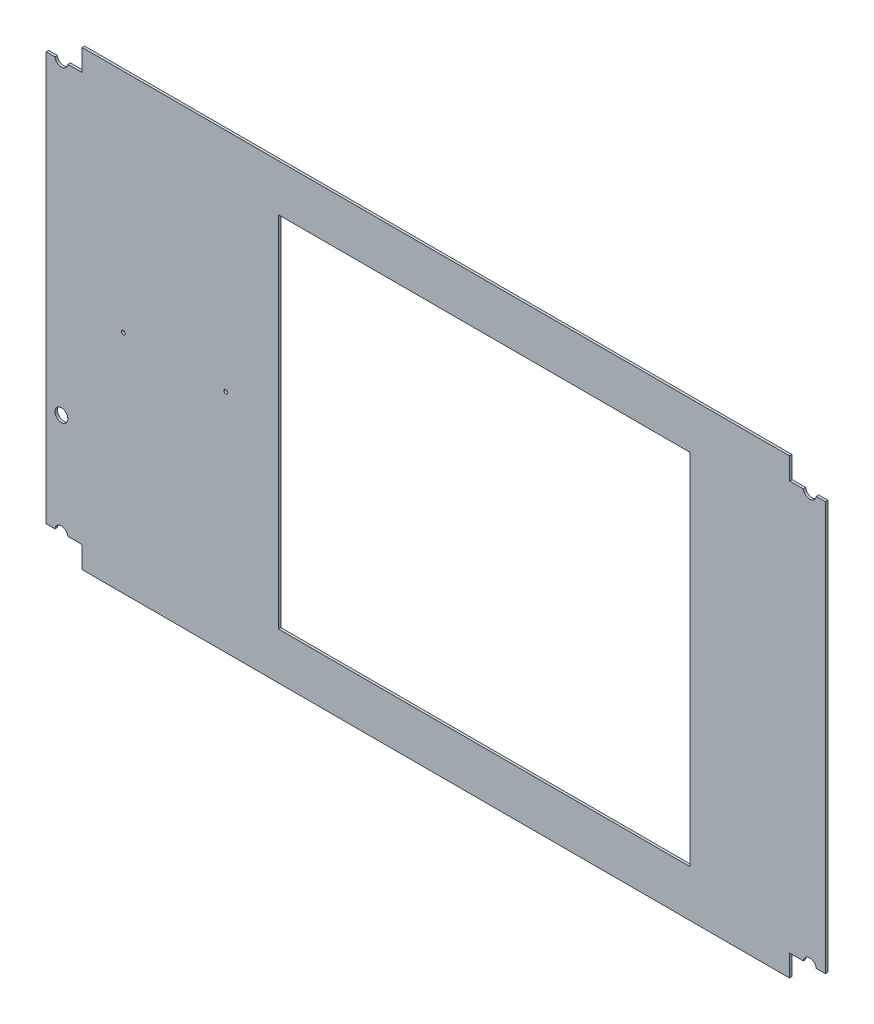
ISO-10303-21;
HEADER;
FILE_DESCRIPTION(('STEP AP214'),'2;1');
FILE_NAME('part.step','',(''),(''),'','','');
FILE_SCHEMA(('AUTOMOTIVE_DESIGN { 1 0 10303 214 1 1 1 1 }'));
ENDSEC;
DATA;
#1=APPLICATION_CONTEXT('core data for automotive mechanical design processes');
#2=APPLICATION_PROTOCOL_DEFINITION('international standard','automotive_design',2000,#1);
#3=PRODUCT_CONTEXT('',#1,'mechanical');
#4=PRODUCT('Part','Part','',(#3));
#5=PRODUCT_RELATED_PRODUCT_CATEGORY('part','',(#4));
#6=PRODUCT_DEFINITION_FORMATION('','',#4);
#7=PRODUCT_DEFINITION_CONTEXT('part definition',#1,'design');
#8=PRODUCT_DEFINITION('design','',#6,#7);
#9=PRODUCT_DEFINITION_SHAPE('','',#8);
#10=(LENGTH_UNIT() NAMED_UNIT(*) SI_UNIT(.MILLI.,.METRE.));
#11=(NAMED_UNIT(*) PLANE_ANGLE_UNIT() SI_UNIT($,.RADIAN.));
#12=(NAMED_UNIT(*) SI_UNIT($,.STERADIAN.) SOLID_ANGLE_UNIT());
#13=UNCERTAINTY_MEASURE_WITH_UNIT(LENGTH_MEASURE(1.E-05),#10,'distance_accuracy_value','');
#14=(GEOMETRIC_REPRESENTATION_CONTEXT(3) GLOBAL_UNCERTAINTY_ASSIGNED_CONTEXT((#13)) GLOBAL_UNIT_ASSIGNED_CONTEXT((#10,
#11,#12)) REPRESENTATION_CONTEXT('',''));
#15=CARTESIAN_POINT('',(0.,0.,0.));
#16=DIRECTION('',(0.,0.,1.));
#17=DIRECTION('',(1.,0.,0.));
#18=AXIS2_PLACEMENT_3D('',#15,#16,#17);
#19=CARTESIAN_POINT('',(-241.3,-126.619,-1.524));
#20=DIRECTION('',(0.,-1.,0.));
#21=DIRECTION('',(0.,0.,-1.));
#22=AXIS2_PLACEMENT_3D('',#19,#20,#21);
#23=PLANE('',#22);
#24=DIRECTION('',(0.,0.,1.));
#25=VECTOR('',#24,1.);
#26=CARTESIAN_POINT('',(-227.869875001938,-126.619,-16.0030000000001));
#27=LINE('',#26,#25);
#28=CARTESIAN_POINT('',(-227.869875001938,-126.619,-1.524));
#29=VERTEX_POINT('',#28);
#30=CARTESIAN_POINT('',(-227.869875001938,-126.619,0.));
#31=VERTEX_POINT('',#30);
#32=EDGE_CURVE('E418',#29,#31,#27,.T.);
#33=ORIENTED_EDGE('',*,*,#32,.F.);
#34=DIRECTION('',(1.,0.,0.));
#35=VECTOR('',#34,1.);
#36=CARTESIAN_POINT('',(-241.3,-126.619,-1.524));
#37=LINE('',#36,#35);
#38=CARTESIAN_POINT('',(-219.2274,-126.619,-1.524));
#39=VERTEX_POINT('',#38);
#40=EDGE_CURVE('E582',#29,#39,#37,.T.);
#41=ORIENTED_EDGE('',*,*,#40,.T.);
#42=DIRECTION('',(0.,0.,1.));
#43=VECTOR('',#42,1.);
#44=CARTESIAN_POINT('',(-219.2274,-126.619,-1.524));
#45=LINE('',#44,#43);
#46=CARTESIAN_POINT('',(-219.2274,-126.619,0.));
#47=VERTEX_POINT('',#46);
#48=EDGE_CURVE('E468',#39,#47,#45,.T.);
#49=ORIENTED_EDGE('',*,*,#48,.T.);
#50=DIRECTION('',(1.,0.,0.));
#51=VECTOR('',#50,1.);
#52=CARTESIAN_POINT('',(-241.3,-126.619,0.));
#53=LINE('',#52,#51);
#54=EDGE_CURVE('E602',#31,#47,#53,.T.);
#55=ORIENTED_EDGE('',*,*,#54,.F.);
#56=EDGE_LOOP('',(#33,#41,#49,#55));
#57=FACE_BOUND('',#56,.T.);
#58=ADVANCED_FACE('F88',(#57),#23,.T.);
#59=DIRECTION('',(0.,0.,1.));
#60=VECTOR('',#59,1.);
#61=CARTESIAN_POINT('',(235.680124998062,-126.619,-16.0030000000001));
#62=LINE('',#61,#60);
#63=CARTESIAN_POINT('',(235.680124998062,-126.619,-1.524));
#64=VERTEX_POINT('',#63);
#65=CARTESIAN_POINT('',(235.680124998062,-126.619,0.));
#66=VERTEX_POINT('',#65);
#67=EDGE_CURVE('E402',#64,#66,#62,.T.);
#68=ORIENTED_EDGE('',*,*,#67,.F.);
#69=CARTESIAN_POINT('',(241.3,-126.619,-1.524));
#70=VERTEX_POINT('',#69);
#71=EDGE_CURVE('E576',#64,#70,#37,.T.);
#72=ORIENTED_EDGE('',*,*,#71,.T.);
#73=DIRECTION('',(0.,0.,1.));
#74=VECTOR('',#73,1.);
#75=CARTESIAN_POINT('',(241.3,-126.619,-1.524));
#76=LINE('',#75,#74);
#77=CARTESIAN_POINT('',(241.3,-126.619,0.));
#78=VERTEX_POINT('',#77);
#79=EDGE_CURVE('E604',#70,#78,#76,.T.);
#80=ORIENTED_EDGE('',*,*,#79,.T.);
#81=EDGE_CURVE('E598',#66,#78,#53,.T.);
#82=ORIENTED_EDGE('',*,*,#81,.F.);
#83=EDGE_LOOP('',(#68,#72,#80,#82));
#84=FACE_BOUND('',#83,.T.);
#85=ADVANCED_FACE('F670',(#84),#23,.T.);
#86=CARTESIAN_POINT('',(-241.3,126.619,-1.524));
#87=DIRECTION('',(0.,1.,0.));
#88=DIRECTION('',(0.,0.,1.));
#89=AXIS2_PLACEMENT_3D('',#86,#87,#88);
#90=PLANE('',#89);
#91=DIRECTION('',(0.,0.,1.));
#92=VECTOR('',#91,1.);
#93=CARTESIAN_POINT('',(227.615875001938,126.619,-16.0030000000001));
#94=LINE('',#93,#92);
#95=CARTESIAN_POINT('',(227.615875001937,126.619,-1.524));
#96=VERTEX_POINT('',#95);
#97=CARTESIAN_POINT('',(227.615875001938,126.619,0.));
#98=VERTEX_POINT('',#97);
#99=EDGE_CURVE('E451',#96,#98,#94,.T.);
#100=ORIENTED_EDGE('',*,*,#99,.F.);
#101=DIRECTION('',(-1.,0.,0.));
#102=VECTOR('',#101,1.);
#103=CARTESIAN_POINT('',(-241.3,126.619,-1.524));
#104=LINE('',#103,#102);
#105=CARTESIAN_POINT('',(219.2274,126.619,-1.524));
#106=VERTEX_POINT('',#105);
#107=EDGE_CURVE('E571',#96,#106,#104,.T.);
#108=ORIENTED_EDGE('',*,*,#107,.T.);
#109=DIRECTION('',(0.,0.,1.));
#110=VECTOR('',#109,1.);
#111=CARTESIAN_POINT('',(219.2274,126.619,-1.52399999999998));
#112=LINE('',#111,#110);
#113=CARTESIAN_POINT('',(219.2274,126.619,0.));
#114=VERTEX_POINT('',#113);
#115=EDGE_CURVE('E520',#106,#114,#112,.T.);
#116=ORIENTED_EDGE('',*,*,#115,.T.);
#117=DIRECTION('',(-1.,0.,0.));
#118=VECTOR('',#117,1.);
#119=CARTESIAN_POINT('',(-241.3,126.619,0.));
#120=LINE('',#119,#118);
#121=EDGE_CURVE('E593',#98,#114,#120,.T.);
#122=ORIENTED_EDGE('',*,*,#121,.F.);
#123=EDGE_LOOP('',(#100,#108,#116,#122));
#124=FACE_BOUND('',#123,.T.);
#125=ADVANCED_FACE('F706',(#124),#90,.T.);
#126=DIRECTION('',(0.,0.,1.));
#127=VECTOR('',#126,1.);
#128=CARTESIAN_POINT('',(-235.934124998062,126.619,-16.0030000000001));
#129=LINE('',#128,#127);
#130=CARTESIAN_POINT('',(-235.934124998062,126.619,-1.524));
#131=VERTEX_POINT('',#130);
#132=CARTESIAN_POINT('',(-235.934124998062,126.619,0.));
#133=VERTEX_POINT('',#132);
#134=EDGE_CURVE('E439',#131,#133,#129,.T.);
#135=ORIENTED_EDGE('',*,*,#134,.F.);
#136=CARTESIAN_POINT('',(-241.3,126.619,-1.524));
#137=VERTEX_POINT('',#136);
#138=EDGE_CURVE('E564',#131,#137,#104,.T.);
#139=ORIENTED_EDGE('',*,*,#138,.T.);
#140=DIRECTION('',(0.,0.,1.));
#141=VECTOR('',#140,1.);
#142=CARTESIAN_POINT('',(-241.3,126.619,-1.524));
#143=LINE('',#142,#141);
#144=CARTESIAN_POINT('',(-241.3,126.619,0.));
#145=VERTEX_POINT('',#144);
#146=EDGE_CURVE('E612',#137,#145,#143,.T.);
#147=ORIENTED_EDGE('',*,*,#146,.T.);
#148=EDGE_CURVE('E587',#133,#145,#120,.T.);
#149=ORIENTED_EDGE('',*,*,#148,.F.);
#150=EDGE_LOOP('',(#135,#139,#147,#149));
#151=FACE_BOUND('',#150,.T.);
#152=ADVANCED_FACE('F813',(#151),#90,.T.);
#153=CARTESIAN_POINT('',(0.,0.,-1.524));
#154=DIRECTION('',(0.,0.,-1.));
#155=DIRECTION('',(-1.,0.,0.));
#156=AXIS2_PLACEMENT_3D('',#153,#154,#155);
#157=PLANE('',#156);
#158=DIRECTION('',(0.,-1.,0.));
#159=VECTOR('',#158,1.);
#160=CARTESIAN_POINT('',(157.48,0.,-1.524));
#161=LINE('',#160,#159);
#162=CARTESIAN_POINT('',(157.48,111.125,-1.524));
#163=VERTEX_POINT('',#162);
#164=CARTESIAN_POINT('',(157.48,-111.125,-1.524));
#165=VERTEX_POINT('',#164);
#166=EDGE_CURVE('E395',#163,#165,#161,.T.);
#167=ORIENTED_EDGE('',*,*,#166,.F.);
#168=DIRECTION('',(1.,0.,0.));
#169=VECTOR('',#168,1.);
#170=CARTESIAN_POINT('',(0.,111.125,-1.524));
#171=LINE('',#170,#169);
#172=CARTESIAN_POINT('',(-97.5359999999999,111.125,-1.524));
#173=VERTEX_POINT('',#172);
#174=EDGE_CURVE('E386',#173,#163,#171,.T.);
#175=ORIENTED_EDGE('',*,*,#174,.F.);
#176=DIRECTION('',(0.,1.,0.));
#177=VECTOR('',#176,1.);
#178=CARTESIAN_POINT('',(-97.5359999999999,0.,-1.524));
#179=LINE('',#178,#177);
#180=CARTESIAN_POINT('',(-97.5359999999999,-111.125,-1.524));
#181=VERTEX_POINT('',#180);
#182=EDGE_CURVE('E389',#181,#173,#179,.T.);
#183=ORIENTED_EDGE('',*,*,#182,.F.);
#184=DIRECTION('',(-1.,0.,0.));
#185=VECTOR('',#184,1.);
#186=CARTESIAN_POINT('',(0.,-111.125,-1.524));
#187=LINE('',#186,#185);
#188=EDGE_CURVE('E392',#165,#181,#187,.T.);
#189=ORIENTED_EDGE('',*,*,#188,.F.);
#190=EDGE_LOOP('',(#167,#175,#183,#189));
#191=FACE_BOUND('',#190,.T.);
#192=CARTESIAN_POINT('',(-193.548,-0.126999999999988,-1.524));
#193=DIRECTION('',(0.,0.,-1.));
#194=DIRECTION('',(-1.,0.,0.));
#195=AXIS2_PLACEMENT_3D('',#192,#193,#194);
#196=CIRCLE('',#195,1.2065);
#197=CARTESIAN_POINT('',(-194.7545,-0.126999999999988,-1.524));
#198=VERTEX_POINT('',#197);
#199=EDGE_CURVE('E382',#198,#198,#196,.T.);
#200=ORIENTED_EDGE('',*,*,#199,.F.);
#201=EDGE_LOOP('',(#200));
#202=FACE_BOUND('',#201,.T.);
#203=CARTESIAN_POINT('',(-130.048,-0.126999999999988,-1.524));
#204=DIRECTION('',(0.,0.,-1.));
#205=DIRECTION('',(-1.,0.,0.));
#206=AXIS2_PLACEMENT_3D('',#203,#204,#205);
#207=CIRCLE('',#206,1.2065);
#208=CARTESIAN_POINT('',(-131.2545,-0.126999999999988,-1.524));
#209=VERTEX_POINT('',#208);
#210=EDGE_CURVE('E365',#209,#209,#207,.T.);
#211=ORIENTED_EDGE('',*,*,#210,.F.);
#212=EDGE_LOOP('',(#211));
#213=FACE_BOUND('',#212,.T.);
#214=CARTESIAN_POINT('',(-231.902,127.127,-1.524));
#215=DIRECTION('',(0.,0.,-1.));
#216=DIRECTION('',(-1.,0.,0.));
#217=AXIS2_PLACEMENT_3D('',#214,#215,#216);
#218=CIRCLE('',#217,4.06400000000002);
#219=CARTESIAN_POINT('',(-227.869875001938,126.619,-1.524));
#220=VERTEX_POINT('',#219);
#221=EDGE_CURVE('E436',#131,#220,#218,.F.);
#222=ORIENTED_EDGE('',*,*,#221,.T.);
#223=CARTESIAN_POINT('',(-219.2274,126.619,-1.524));
#224=VERTEX_POINT('',#223);
#225=EDGE_CURVE('E572',#224,#220,#104,.T.);
#226=ORIENTED_EDGE('',*,*,#225,.F.);
#227=DIRECTION('',(0.,1.,0.));
#228=VECTOR('',#227,1.);
#229=CARTESIAN_POINT('',(-219.2274,123.4186,-1.52400000000002));
#230=LINE('',#229,#228);
#231=CARTESIAN_POINT('',(-219.2274,123.4186,-1.524));
#232=VERTEX_POINT('',#231);
#233=EDGE_CURVE('E538',#232,#224,#230,.T.);
#234=ORIENTED_EDGE('',*,*,#233,.F.);
#235=DIRECTION('',(-1.,0.,0.));
#236=VECTOR('',#235,1.);
#237=CARTESIAN_POINT('',(-219.075,123.4186,-1.52400000000002));
#238=LINE('',#237,#236);
#239=CARTESIAN_POINT('',(-219.075,123.4186,-1.524));
#240=VERTEX_POINT('',#239);
#241=EDGE_CURVE('E533',#240,#232,#238,.T.);
#242=ORIENTED_EDGE('',*,*,#241,.F.);
#243=DIRECTION('',(0.,-1.,0.));
#244=VECTOR('',#243,1.);
#245=CARTESIAN_POINT('',(-219.075,123.571,-1.52400000000002));
#246=LINE('',#245,#244);
#247=CARTESIAN_POINT('',(-219.075,140.067962531012,-1.52399999999989));
#248=VERTEX_POINT('',#247);
#249=EDGE_CURVE('E529',#248,#240,#246,.T.);
#250=ORIENTED_EDGE('',*,*,#249,.F.);
#251=DIRECTION('',(-1.,0.,0.));
#252=VECTOR('',#251,1.);
#253=CARTESIAN_POINT('',(0.,140.067962531013,-1.52399999999986));
#254=LINE('',#253,#252);
#255=CARTESIAN_POINT('',(219.075,140.067962531013,-1.52399999999983));
#256=VERTEX_POINT('',#255);
#257=EDGE_CURVE('E319',#248,#256,#254,.F.);
#258=ORIENTED_EDGE('',*,*,#257,.T.);
#259=DIRECTION('',(0.,1.,0.));
#260=VECTOR('',#259,1.);
#261=CARTESIAN_POINT('',(219.075,123.4186,-1.52399999999996));
#262=LINE('',#261,#260);
#263=CARTESIAN_POINT('',(219.075,123.4186,-1.524));
#264=VERTEX_POINT('',#263);
#265=EDGE_CURVE('E314',#264,#256,#262,.T.);
#266=ORIENTED_EDGE('',*,*,#265,.F.);
#267=DIRECTION('',(-1.,0.,0.));
#268=VECTOR('',#267,1.);
#269=CARTESIAN_POINT('',(219.2274,123.4186,-1.52399999999996));
#270=LINE('',#269,#268);
#271=CARTESIAN_POINT('',(219.2274,123.4186,-1.524));
#272=VERTEX_POINT('',#271);
#273=EDGE_CURVE('E521',#272,#264,#270,.T.);
#274=ORIENTED_EDGE('',*,*,#273,.F.);
#275=DIRECTION('',(0.,-1.,0.));
#276=VECTOR('',#275,1.);
#277=CARTESIAN_POINT('',(219.2274,126.619,-1.52399999999998));
#278=LINE('',#277,#276);
#279=EDGE_CURVE('E515',#106,#272,#278,.T.);
#280=ORIENTED_EDGE('',*,*,#279,.F.);
#281=ORIENTED_EDGE('',*,*,#107,.F.);
#282=CARTESIAN_POINT('',(231.648,127.127,-1.524));
#283=DIRECTION('',(0.,0.,-1.));
#284=DIRECTION('',(-1.,0.,0.));
#285=AXIS2_PLACEMENT_3D('',#282,#283,#284);
#286=CIRCLE('',#285,4.06400000000002);
#287=CARTESIAN_POINT('',(235.680124998062,126.619,-1.524));
#288=VERTEX_POINT('',#287);
#289=EDGE_CURVE('E456',#96,#288,#286,.F.);
#290=ORIENTED_EDGE('',*,*,#289,.T.);
#291=CARTESIAN_POINT('',(241.3,126.619,-1.524));
#292=VERTEX_POINT('',#291);
#293=EDGE_CURVE('E566',#292,#288,#104,.T.);
#294=ORIENTED_EDGE('',*,*,#293,.F.);
#295=DIRECTION('',(0.,1.,0.));
#296=VECTOR('',#295,1.);
#297=CARTESIAN_POINT('',(241.3,-126.619,-1.524));
#298=LINE('',#297,#296);
#299=EDGE_CURVE('E560',#70,#292,#298,.T.);
#300=ORIENTED_EDGE('',*,*,#299,.F.);
#301=ORIENTED_EDGE('',*,*,#71,.F.);
#302=CARTESIAN_POINT('',(231.648,-127.127,-1.524));
#303=DIRECTION('',(0.,0.,-1.));
#304=DIRECTION('',(-1.,0.,0.));
#305=AXIS2_PLACEMENT_3D('',#302,#303,#304);
#306=CIRCLE('',#305,4.06400000000002);
#307=CARTESIAN_POINT('',(227.615875001938,-126.619,-1.524));
#308=VERTEX_POINT('',#307);
#309=EDGE_CURVE('E408',#64,#308,#306,.F.);
#310=ORIENTED_EDGE('',*,*,#309,.T.);
#311=CARTESIAN_POINT('',(219.2274,-126.619,-1.524));
#312=VERTEX_POINT('',#311);
#313=EDGE_CURVE('E583',#312,#308,#37,.T.);
#314=ORIENTED_EDGE('',*,*,#313,.F.);
#315=DIRECTION('',(0.,-1.,0.));
#316=VECTOR('',#315,1.);
#317=CARTESIAN_POINT('',(219.2274,-123.4186,-1.524));
#318=LINE('',#317,#316);
#319=CARTESIAN_POINT('',(219.2274,-123.4186,-1.524));
#320=VERTEX_POINT('',#319);
#321=EDGE_CURVE('E487',#320,#312,#318,.T.);
#322=ORIENTED_EDGE('',*,*,#321,.F.);
#323=DIRECTION('',(1.,0.,0.));
#324=VECTOR('',#323,1.);
#325=CARTESIAN_POINT('',(219.075,-123.4186,-1.524));
#326=LINE('',#325,#324);
#327=CARTESIAN_POINT('',(219.075,-123.4186,-1.524));
#328=VERTEX_POINT('',#327);
#329=EDGE_CURVE('E482',#328,#320,#326,.T.);
#330=ORIENTED_EDGE('',*,*,#329,.F.);
#331=DIRECTION('',(0.,1.,0.));
#332=VECTOR('',#331,1.);
#333=CARTESIAN_POINT('',(219.075,-123.571,-1.524));
#334=LINE('',#333,#332);
#335=CARTESIAN_POINT('',(219.075,-140.067962531013,-1.52399999999989));
#336=VERTEX_POINT('',#335);
#337=EDGE_CURVE('E478',#336,#328,#334,.T.);
#338=ORIENTED_EDGE('',*,*,#337,.F.);
#339=DIRECTION('',(-1.,0.,0.));
#340=VECTOR('',#339,1.);
#341=CARTESIAN_POINT('',(0.,-140.067962531013,-1.52399999999989));
#342=LINE('',#341,#340);
#343=CARTESIAN_POINT('',(-219.075,-140.067962531013,-1.52399999999989));
#344=VERTEX_POINT('',#343);
#345=EDGE_CURVE('E335',#336,#344,#342,.T.);
#346=ORIENTED_EDGE('',*,*,#345,.T.);
#347=DIRECTION('',(0.,-1.,0.));
#348=VECTOR('',#347,1.);
#349=CARTESIAN_POINT('',(-219.075,-123.4186,-1.524));
#350=LINE('',#349,#348);
#351=CARTESIAN_POINT('',(-219.075,-123.4186,-1.524));
#352=VERTEX_POINT('',#351);
#353=EDGE_CURVE('E474',#352,#344,#350,.T.);
#354=ORIENTED_EDGE('',*,*,#353,.F.);
#355=DIRECTION('',(1.,0.,0.));
#356=VECTOR('',#355,1.);
#357=CARTESIAN_POINT('',(-219.2274,-123.4186,-1.524));
#358=LINE('',#357,#356);
#359=CARTESIAN_POINT('',(-219.2274,-123.4186,-1.524));
#360=VERTEX_POINT('',#359);
#361=EDGE_CURVE('E469',#360,#352,#358,.T.);
#362=ORIENTED_EDGE('',*,*,#361,.F.);
#363=DIRECTION('',(0.,1.,0.));
#364=VECTOR('',#363,1.);
#365=CARTESIAN_POINT('',(-219.2274,-126.619,-1.524));
#366=LINE('',#365,#364);
#367=EDGE_CURVE('E463',#39,#360,#366,.T.);
#368=ORIENTED_EDGE('',*,*,#367,.F.);
#369=ORIENTED_EDGE('',*,*,#40,.F.);
#370=CARTESIAN_POINT('',(-231.902,-127.127,-1.524));
#371=DIRECTION('',(0.,0.,-1.));
#372=DIRECTION('',(-1.,0.,0.));
#373=AXIS2_PLACEMENT_3D('',#370,#371,#372);
#374=CIRCLE('',#373,4.06400000000002);
#375=CARTESIAN_POINT('',(-235.934124998062,-126.619,-1.524));
#376=VERTEX_POINT('',#375);
#377=EDGE_CURVE('E403',#29,#376,#374,.F.);
#378=ORIENTED_EDGE('',*,*,#377,.T.);
#379=CARTESIAN_POINT('',(-241.3,-126.619,-1.524));
#380=VERTEX_POINT('',#379);
#381=EDGE_CURVE('E577',#380,#376,#37,.T.);
#382=ORIENTED_EDGE('',*,*,#381,.F.);
#383=DIRECTION('',(0.,-1.,0.));
#384=VECTOR('',#383,1.);
#385=CARTESIAN_POINT('',(-241.3,-126.619,-1.524));
#386=LINE('',#385,#384);
#387=EDGE_CURVE('E570',#137,#380,#386,.T.);
#388=ORIENTED_EDGE('',*,*,#387,.F.);
#389=ORIENTED_EDGE('',*,*,#138,.F.);
#390=EDGE_LOOP('',(#222,#226,#234,#242,#250,#258,#266,#274,#280,#281,#290,#294,#300,#301,#310,
#314,#322,#330,#338,#346,#354,#362,#368,#369,#378,#382,#388,#389));
#391=FACE_BOUND('',#390,.T.);
#392=CARTESIAN_POINT('',(-231.902,-63.627,-1.524));
#393=DIRECTION('',(0.,0.,-1.));
#394=DIRECTION('',(-1.,0.,0.));
#395=AXIS2_PLACEMENT_3D('',#392,#393,#394);
#396=CIRCLE('',#395,3.96240000000001);
#397=CARTESIAN_POINT('',(-235.8644,-63.627,-1.524));
#398=VERTEX_POINT('',#397);
#399=EDGE_CURVE('E432',#398,#398,#396,.F.);
#400=ORIENTED_EDGE('',*,*,#399,.T.);
#401=EDGE_LOOP('',(#400));
#402=FACE_BOUND('',#401,.T.);
#403=ADVANCED_FACE('F677',(#191,#202,#213,#391,#402),#157,.T.);
#404=CARTESIAN_POINT('',(0.,0.,0.));
#405=DIRECTION('',(0.,0.,-1.));
#406=DIRECTION('',(-1.,0.,0.));
#407=AXIS2_PLACEMENT_3D('',#404,#405,#406);
#408=PLANE('',#407);
#409=DIRECTION('',(-1.,0.,0.));
#410=VECTOR('',#409,1.);
#411=CARTESIAN_POINT('',(-97.5359999999999,111.125,0.));
#412=LINE('',#411,#410);
#413=CARTESIAN_POINT('',(157.48,111.125,0.));
#414=VERTEX_POINT('',#413);
#415=CARTESIAN_POINT('',(-97.5359999999999,111.125,0.));
#416=VERTEX_POINT('',#415);
#417=EDGE_CURVE('E349',#414,#416,#412,.T.);
#418=ORIENTED_EDGE('',*,*,#417,.F.);
#419=DIRECTION('',(0.,1.,0.));
#420=VECTOR('',#419,1.);
#421=CARTESIAN_POINT('',(157.48,111.125,0.));
#422=LINE('',#421,#420);
#423=CARTESIAN_POINT('',(157.48,-111.125,0.));
#424=VERTEX_POINT('',#423);
#425=EDGE_CURVE('E112',#424,#414,#422,.T.);
#426=ORIENTED_EDGE('',*,*,#425,.F.);
#427=DIRECTION('',(1.,0.,0.));
#428=VECTOR('',#427,1.);
#429=CARTESIAN_POINT('',(-97.5359999999999,-111.125,0.));
#430=LINE('',#429,#428);
#431=CARTESIAN_POINT('',(-97.5359999999999,-111.125,0.));
#432=VERTEX_POINT('',#431);
#433=EDGE_CURVE('E357',#432,#424,#430,.T.);
#434=ORIENTED_EDGE('',*,*,#433,.F.);
#435=DIRECTION('',(0.,-1.,0.));
#436=VECTOR('',#435,1.);
#437=CARTESIAN_POINT('',(-97.5359999999999,111.125,0.));
#438=LINE('',#437,#436);
#439=EDGE_CURVE('E353',#416,#432,#438,.T.);
#440=ORIENTED_EDGE('',*,*,#439,.F.);
#441=EDGE_LOOP('',(#418,#426,#434,#440));
#442=FACE_BOUND('',#441,.T.);
#443=CARTESIAN_POINT('',(-193.548,-0.126999999999988,0.));
#444=DIRECTION('',(0.,0.,1.));
#445=DIRECTION('',(1.,0.,0.));
#446=AXIS2_PLACEMENT_3D('',#443,#444,#445);
#447=CIRCLE('',#446,1.2065);
#448=CARTESIAN_POINT('',(-192.3415,-0.126999999999988,0.));
#449=VERTEX_POINT('',#448);
#450=EDGE_CURVE('E350',#449,#449,#447,.T.);
#451=ORIENTED_EDGE('',*,*,#450,.F.);
#452=EDGE_LOOP('',(#451));
#453=FACE_BOUND('',#452,.T.);
#454=CARTESIAN_POINT('',(-130.048,-0.126999999999988,0.));
#455=DIRECTION('',(0.,0.,1.));
#456=DIRECTION('',(1.,0.,0.));
#457=AXIS2_PLACEMENT_3D('',#454,#455,#456);
#458=CIRCLE('',#457,1.2065);
#459=CARTESIAN_POINT('',(-128.8415,-0.126999999999988,0.));
#460=VERTEX_POINT('',#459);
#461=EDGE_CURVE('E334',#460,#460,#458,.T.);
#462=ORIENTED_EDGE('',*,*,#461,.F.);
#463=EDGE_LOOP('',(#462));
#464=FACE_BOUND('',#463,.T.);
#465=CARTESIAN_POINT('',(-231.902,-63.627,0.));
#466=DIRECTION('',(0.,0.,1.));
#467=DIRECTION('',(1.,0.,0.));
#468=AXIS2_PLACEMENT_3D('',#465,#466,#467);
#469=CIRCLE('',#468,3.96240000000001);
#470=CARTESIAN_POINT('',(-227.9396,-63.627,0.));
#471=VERTEX_POINT('',#470);
#472=EDGE_CURVE('E419',#471,#471,#469,.T.);
#473=ORIENTED_EDGE('',*,*,#472,.F.);
#474=EDGE_LOOP('',(#473));
#475=FACE_BOUND('',#474,.T.);
#476=CARTESIAN_POINT('',(-219.2274,126.619,0.));
#477=VERTEX_POINT('',#476);
#478=CARTESIAN_POINT('',(-227.869875001938,126.619,0.));
#479=VERTEX_POINT('',#478);
#480=EDGE_CURVE('E594',#477,#479,#120,.T.);
#481=ORIENTED_EDGE('',*,*,#480,.T.);
#482=CARTESIAN_POINT('',(-231.902,127.127,0.));
#483=DIRECTION('',(0.,0.,1.));
#484=DIRECTION('',(1.,0.,0.));
#485=AXIS2_PLACEMENT_3D('',#482,#483,#484);
#486=CIRCLE('',#485,4.06400000000002);
#487=EDGE_CURVE('E398',#133,#479,#486,.T.);
#488=ORIENTED_EDGE('',*,*,#487,.F.);
#489=ORIENTED_EDGE('',*,*,#148,.T.);
#490=DIRECTION('',(0.,-1.,0.));
#491=VECTOR('',#490,1.);
#492=CARTESIAN_POINT('',(-241.3,-126.619,0.));
#493=LINE('',#492,#491);
#494=CARTESIAN_POINT('',(-241.3,-126.619,0.));
#495=VERTEX_POINT('',#494);
#496=EDGE_CURVE('E592',#145,#495,#493,.T.);
#497=ORIENTED_EDGE('',*,*,#496,.T.);
#498=CARTESIAN_POINT('',(-235.934124998062,-126.619,0.));
#499=VERTEX_POINT('',#498);
#500=EDGE_CURVE('E565',#495,#499,#53,.T.);
#501=ORIENTED_EDGE('',*,*,#500,.T.);
#502=CARTESIAN_POINT('',(-231.902,-127.127,0.));
#503=DIRECTION('',(0.,0.,1.));
#504=DIRECTION('',(1.,0.,0.));
#505=AXIS2_PLACEMENT_3D('',#502,#503,#504);
#506=CIRCLE('',#505,4.06400000000002);
#507=EDGE_CURVE('E415',#31,#499,#506,.T.);
#508=ORIENTED_EDGE('',*,*,#507,.F.);
#509=ORIENTED_EDGE('',*,*,#54,.T.);
#510=DIRECTION('',(0.,-1.,0.));
#511=VECTOR('',#510,1.);
#512=CARTESIAN_POINT('',(-219.2274,0.,0.));
#513=LINE('',#512,#511);
#514=CARTESIAN_POINT('',(-219.2274,-123.4186,0.));
#515=VERTEX_POINT('',#514);
#516=EDGE_CURVE('E510',#515,#47,#513,.T.);
#517=ORIENTED_EDGE('',*,*,#516,.F.);
#518=DIRECTION('',(-1.,0.,0.));
#519=VECTOR('',#518,1.);
#520=CARTESIAN_POINT('',(0.,-123.4186,0.));
#521=LINE('',#520,#519);
#522=CARTESIAN_POINT('',(-219.075,-123.4186,0.));
#523=VERTEX_POINT('',#522);
#524=EDGE_CURVE('E13',#523,#515,#521,.T.);
#525=ORIENTED_EDGE('',*,*,#524,.F.);
#526=DIRECTION('',(0.,1.,0.));
#527=VECTOR('',#526,1.);
#528=CARTESIAN_POINT('',(-219.075,0.,0.));
#529=LINE('',#528,#527);
#530=CARTESIAN_POINT('',(-219.075,-140.067962531013,1.11022302462516E-13));
#531=VERTEX_POINT('',#530);
#532=EDGE_CURVE('E97',#531,#523,#529,.T.);
#533=ORIENTED_EDGE('',*,*,#532,.F.);
#534=DIRECTION('',(1.,0.,0.));
#535=VECTOR('',#534,1.);
#536=CARTESIAN_POINT('',(219.075,-140.067962531013,1.11022302462516E-13));
#537=LINE('',#536,#535);
#538=CARTESIAN_POINT('',(219.075,-140.067962531013,1.11022302462516E-13));
#539=VERTEX_POINT('',#538);
#540=EDGE_CURVE('E343',#539,#531,#537,.F.);
#541=ORIENTED_EDGE('',*,*,#540,.F.);
#542=DIRECTION('',(0.,-1.,0.));
#543=VECTOR('',#542,1.);
#544=CARTESIAN_POINT('',(219.075,0.,0.));
#545=LINE('',#544,#543);
#546=CARTESIAN_POINT('',(219.075,-123.4186,0.));
#547=VERTEX_POINT('',#546);
#548=EDGE_CURVE('E636',#547,#539,#545,.T.);
#549=ORIENTED_EDGE('',*,*,#548,.F.);
#550=DIRECTION('',(-1.,0.,0.));
#551=VECTOR('',#550,1.);
#552=CARTESIAN_POINT('',(0.,-123.4186,0.));
#553=LINE('',#552,#551);
#554=CARTESIAN_POINT('',(219.2274,-123.4186,0.));
#555=VERTEX_POINT('',#554);
#556=EDGE_CURVE('E633',#555,#547,#553,.T.);
#557=ORIENTED_EDGE('',*,*,#556,.F.);
#558=DIRECTION('',(0.,1.,0.));
#559=VECTOR('',#558,1.);
#560=CARTESIAN_POINT('',(219.2274,0.,0.));
#561=LINE('',#560,#559);
#562=CARTESIAN_POINT('',(219.2274,-126.619,0.));
#563=VERTEX_POINT('',#562);
#564=EDGE_CURVE('E467',#563,#555,#561,.T.);
#565=ORIENTED_EDGE('',*,*,#564,.F.);
#566=CARTESIAN_POINT('',(227.615875001937,-126.619,0.));
#567=VERTEX_POINT('',#566);
#568=EDGE_CURVE('E603',#563,#567,#53,.T.);
#569=ORIENTED_EDGE('',*,*,#568,.T.);
#570=CARTESIAN_POINT('',(231.648,-127.127,0.));
#571=DIRECTION('',(0.,0.,1.));
#572=DIRECTION('',(1.,0.,0.));
#573=AXIS2_PLACEMENT_3D('',#570,#571,#572);
#574=CIRCLE('',#573,4.06400000000002);
#575=EDGE_CURVE('E399',#66,#567,#574,.T.);
#576=ORIENTED_EDGE('',*,*,#575,.F.);
#577=ORIENTED_EDGE('',*,*,#81,.T.);
#578=DIRECTION('',(0.,1.,0.));
#579=VECTOR('',#578,1.);
#580=CARTESIAN_POINT('',(241.3,-126.619,0.));
#581=LINE('',#580,#579);
#582=CARTESIAN_POINT('',(241.3,126.619,0.));
#583=VERTEX_POINT('',#582);
#584=EDGE_CURVE('E519',#78,#583,#581,.T.);
#585=ORIENTED_EDGE('',*,*,#584,.T.);
#586=CARTESIAN_POINT('',(235.680124998062,126.619,0.));
#587=VERTEX_POINT('',#586);
#588=EDGE_CURVE('E588',#583,#587,#120,.T.);
#589=ORIENTED_EDGE('',*,*,#588,.T.);
#590=CARTESIAN_POINT('',(231.648,127.127,0.));
#591=DIRECTION('',(0.,0.,1.));
#592=DIRECTION('',(1.,0.,0.));
#593=AXIS2_PLACEMENT_3D('',#590,#591,#592);
#594=CIRCLE('',#593,4.06400000000002);
#595=EDGE_CURVE('E414',#98,#587,#594,.T.);
#596=ORIENTED_EDGE('',*,*,#595,.F.);
#597=ORIENTED_EDGE('',*,*,#121,.T.);
#598=DIRECTION('',(0.,1.,0.));
#599=VECTOR('',#598,1.);
#600=CARTESIAN_POINT('',(219.2274,0.,0.));
#601=LINE('',#600,#599);
#602=CARTESIAN_POINT('',(219.2274,123.4186,0.));
#603=VERTEX_POINT('',#602);
#604=EDGE_CURVE('E629',#603,#114,#601,.T.);
#605=ORIENTED_EDGE('',*,*,#604,.F.);
#606=DIRECTION('',(1.,0.,0.));
#607=VECTOR('',#606,1.);
#608=CARTESIAN_POINT('',(0.,123.4186,0.));
#609=LINE('',#608,#607);
#610=CARTESIAN_POINT('',(219.075,123.4186,0.));
#611=VERTEX_POINT('',#610);
#612=EDGE_CURVE('E304',#611,#603,#609,.T.);
#613=ORIENTED_EDGE('',*,*,#612,.F.);
#614=DIRECTION('',(0.,-1.,0.));
#615=VECTOR('',#614,1.);
#616=CARTESIAN_POINT('',(219.075,0.,0.));
#617=LINE('',#616,#615);
#618=CARTESIAN_POINT('',(219.075,140.067962531013,1.66533453693773E-13));
#619=VERTEX_POINT('',#618);
#620=EDGE_CURVE('E298',#619,#611,#617,.T.);
#621=ORIENTED_EDGE('',*,*,#620,.F.);
#622=DIRECTION('',(1.,0.,0.));
#623=VECTOR('',#622,1.);
#624=CARTESIAN_POINT('',(219.075,140.067962531013,1.66533453693773E-13));
#625=LINE('',#624,#623);
#626=CARTESIAN_POINT('',(-219.075,140.067962531012,1.11022302462516E-13));
#627=VERTEX_POINT('',#626);
#628=EDGE_CURVE('E302',#627,#619,#625,.T.);
#629=ORIENTED_EDGE('',*,*,#628,.F.);
#630=DIRECTION('',(0.,1.,0.));
#631=VECTOR('',#630,1.);
#632=CARTESIAN_POINT('',(-219.075,0.,0.));
#633=LINE('',#632,#631);
#634=CARTESIAN_POINT('',(-219.075,123.4186,0.));
#635=VERTEX_POINT('',#634);
#636=EDGE_CURVE('E309',#635,#627,#633,.T.);
#637=ORIENTED_EDGE('',*,*,#636,.F.);
#638=DIRECTION('',(1.,0.,0.));
#639=VECTOR('',#638,1.);
#640=CARTESIAN_POINT('',(0.,123.4186,0.));
#641=LINE('',#640,#639);
#642=CARTESIAN_POINT('',(-219.2274,123.4186,0.));
#643=VERTEX_POINT('',#642);
#644=EDGE_CURVE('E621',#643,#635,#641,.T.);
#645=ORIENTED_EDGE('',*,*,#644,.F.);
#646=DIRECTION('',(0.,-1.,0.));
#647=VECTOR('',#646,1.);
#648=CARTESIAN_POINT('',(-219.2274,0.,0.));
#649=LINE('',#648,#647);
#650=EDGE_CURVE('E608',#477,#643,#649,.T.);
#651=ORIENTED_EDGE('',*,*,#650,.F.);
#652=EDGE_LOOP('',(#481,#488,#489,#497,#501,#508,#509,#517,#525,#533,#541,#549,#557,#565,#569,
#576,#577,#585,#589,#596,#597,#605,#613,#621,#629,#637,#645,#651));
#653=FACE_BOUND('',#652,.T.);
#654=ADVANCED_FACE('F90',(#442,#453,#464,#475,#653),#408,.F.);
#655=DIRECTION('',(0.,0.,1.));
#656=VECTOR('',#655,1.);
#657=CARTESIAN_POINT('',(-235.934124998062,-126.619,-16.0030000000001));
#658=LINE('',#657,#656);
#659=EDGE_CURVE('E420',#376,#499,#658,.T.);
#660=ORIENTED_EDGE('',*,*,#659,.T.);
#661=ORIENTED_EDGE('',*,*,#500,.F.);
#662=DIRECTION('',(0.,0.,1.));
#663=VECTOR('',#662,1.);
#664=CARTESIAN_POINT('',(-241.3,-126.619,-1.524));
#665=LINE('',#664,#663);
#666=EDGE_CURVE('E609',#380,#495,#665,.T.);
#667=ORIENTED_EDGE('',*,*,#666,.F.);
#668=ORIENTED_EDGE('',*,*,#381,.T.);
#669=EDGE_LOOP('',(#660,#661,#667,#668));
#670=FACE_BOUND('',#669,.T.);
#671=ADVANCED_FACE('F726',(#670),#23,.T.);
#672=DIRECTION('',(0.,0.,1.));
#673=VECTOR('',#672,1.);
#674=CARTESIAN_POINT('',(227.615875001938,-126.619,-16.0030000000001));
#675=LINE('',#674,#673);
#676=EDGE_CURVE('E404',#308,#567,#675,.T.);
#677=ORIENTED_EDGE('',*,*,#676,.T.);
#678=ORIENTED_EDGE('',*,*,#568,.F.);
#679=DIRECTION('',(0.,0.,1.));
#680=VECTOR('',#679,1.);
#681=CARTESIAN_POINT('',(219.2274,-126.619,-1.524));
#682=LINE('',#681,#680);
#683=EDGE_CURVE('E490',#312,#563,#682,.T.);
#684=ORIENTED_EDGE('',*,*,#683,.F.);
#685=ORIENTED_EDGE('',*,*,#313,.T.);
#686=EDGE_LOOP('',(#677,#678,#684,#685));
#687=FACE_BOUND('',#686,.T.);
#688=ADVANCED_FACE('F730',(#687),#23,.T.);
#689=DIRECTION('',(0.,0.,1.));
#690=VECTOR('',#689,1.);
#691=CARTESIAN_POINT('',(235.680124998062,126.619,-16.0030000000001));
#692=LINE('',#691,#690);
#693=EDGE_CURVE('E452',#288,#587,#692,.T.);
#694=ORIENTED_EDGE('',*,*,#693,.T.);
#695=ORIENTED_EDGE('',*,*,#588,.F.);
#696=DIRECTION('',(0.,0.,1.));
#697=VECTOR('',#696,1.);
#698=CARTESIAN_POINT('',(241.3,126.619,-1.524));
#699=LINE('',#698,#697);
#700=EDGE_CURVE('E581',#292,#583,#699,.T.);
#701=ORIENTED_EDGE('',*,*,#700,.F.);
#702=ORIENTED_EDGE('',*,*,#293,.T.);
#703=EDGE_LOOP('',(#694,#695,#701,#702));
#704=FACE_BOUND('',#703,.T.);
#705=ADVANCED_FACE('F681',(#704),#90,.T.);
#706=DIRECTION('',(0.,0.,1.));
#707=VECTOR('',#706,1.);
#708=CARTESIAN_POINT('',(-227.869875001938,126.619,-16.0030000000001));
#709=LINE('',#708,#707);
#710=EDGE_CURVE('E440',#220,#479,#709,.T.);
#711=ORIENTED_EDGE('',*,*,#710,.T.);
#712=ORIENTED_EDGE('',*,*,#480,.F.);
#713=DIRECTION('',(0.,0.,1.));
#714=VECTOR('',#713,1.);
#715=CARTESIAN_POINT('',(-219.2274,126.619,-1.52400000000001));
#716=LINE('',#715,#714);
#717=EDGE_CURVE('E542',#224,#477,#716,.T.);
#718=ORIENTED_EDGE('',*,*,#717,.F.);
#719=ORIENTED_EDGE('',*,*,#225,.T.);
#720=EDGE_LOOP('',(#711,#712,#718,#719));
#721=FACE_BOUND('',#720,.T.);
#722=ADVANCED_FACE('F810',(#721),#90,.T.);
#723=CARTESIAN_POINT('',(241.3,-126.619,-1.524));
#724=DIRECTION('',(1.,0.,0.));
#725=DIRECTION('',(0.,0.,-1.));
#726=AXIS2_PLACEMENT_3D('',#723,#724,#725);
#727=PLANE('',#726);
#728=ORIENTED_EDGE('',*,*,#584,.F.);
#729=ORIENTED_EDGE('',*,*,#79,.F.);
#730=ORIENTED_EDGE('',*,*,#299,.T.);
#731=ORIENTED_EDGE('',*,*,#700,.T.);
#732=EDGE_LOOP('',(#728,#729,#730,#731));
#733=FACE_BOUND('',#732,.T.);
#734=ADVANCED_FACE('F675',(#733),#727,.T.);
#735=CARTESIAN_POINT('',(-241.3,-126.619,-1.524));
#736=DIRECTION('',(-1.,0.,0.));
#737=DIRECTION('',(0.,0.,1.));
#738=AXIS2_PLACEMENT_3D('',#735,#736,#737);
#739=PLANE('',#738);
#740=ORIENTED_EDGE('',*,*,#496,.F.);
#741=ORIENTED_EDGE('',*,*,#146,.F.);
#742=ORIENTED_EDGE('',*,*,#387,.T.);
#743=ORIENTED_EDGE('',*,*,#666,.T.);
#744=EDGE_LOOP('',(#740,#741,#742,#743));
#745=FACE_BOUND('',#744,.T.);
#746=ADVANCED_FACE('F722',(#745),#739,.T.);
#747=CARTESIAN_POINT('',(219.2274,126.619,-1.52399999999998));
#748=DIRECTION('',(-1.,0.,0.));
#749=DIRECTION('',(0.,0.,1.));
#750=AXIS2_PLACEMENT_3D('',#747,#748,#749);
#751=PLANE('',#750);
#752=DIRECTION('',(0.,0.,1.));
#753=VECTOR('',#752,1.);
#754=CARTESIAN_POINT('',(219.2274,123.4186,-1.52399999999996));
#755=LINE('',#754,#753);
#756=EDGE_CURVE('E525',#272,#603,#755,.T.);
#757=ORIENTED_EDGE('',*,*,#756,.T.);
#758=ORIENTED_EDGE('',*,*,#604,.T.);
#759=ORIENTED_EDGE('',*,*,#115,.F.);
#760=ORIENTED_EDGE('',*,*,#279,.T.);
#761=EDGE_LOOP('',(#757,#758,#759,#760));
#762=FACE_BOUND('',#761,.T.);
#763=ADVANCED_FACE('F711',(#762),#751,.T.);
#764=CARTESIAN_POINT('',(219.2274,123.4186,-1.52399999999996));
#765=DIRECTION('',(0.,1.,0.));
#766=DIRECTION('',(0.,0.,1.));
#767=AXIS2_PLACEMENT_3D('',#764,#765,#766);
#768=PLANE('',#767);
#769=DIRECTION('',(0.,0.,1.));
#770=VECTOR('',#769,1.);
#771=CARTESIAN_POINT('',(219.075,123.4186,-1.52399999999996));
#772=LINE('',#771,#770);
#773=EDGE_CURVE('E528',#264,#611,#772,.T.);
#774=ORIENTED_EDGE('',*,*,#773,.T.);
#775=ORIENTED_EDGE('',*,*,#612,.T.);
#776=ORIENTED_EDGE('',*,*,#756,.F.);
#777=ORIENTED_EDGE('',*,*,#273,.T.);
#778=EDGE_LOOP('',(#774,#775,#776,#777));
#779=FACE_BOUND('',#778,.T.);
#780=ADVANCED_FACE('F713',(#779),#768,.T.);
#781=CARTESIAN_POINT('',(219.075,123.4186,-1.52399999999996));
#782=DIRECTION('',(1.,0.,0.));
#783=DIRECTION('',(0.,0.,-1.));
#784=AXIS2_PLACEMENT_3D('',#781,#782,#783);
#785=PLANE('',#784);
#786=ORIENTED_EDGE('',*,*,#265,.T.);
#787=DIRECTION('',(0.,0.,-1.));
#788=VECTOR('',#787,1.);
#789=CARTESIAN_POINT('',(219.075,140.067962531013,1.66533453693773E-13));
#790=LINE('',#789,#788);
#791=EDGE_CURVE('E312',#619,#256,#790,.T.);
#792=ORIENTED_EDGE('',*,*,#791,.F.);
#793=ORIENTED_EDGE('',*,*,#620,.T.);
#794=ORIENTED_EDGE('',*,*,#773,.F.);
#795=EDGE_LOOP('',(#786,#792,#793,#794));
#796=FACE_BOUND('',#795,.T.);
#797=ADVANCED_FACE('F313',(#796),#785,.T.);
#798=CARTESIAN_POINT('',(-219.075,123.571,-1.52400000000002));
#799=DIRECTION('',(-1.,0.,0.));
#800=DIRECTION('',(0.,0.,1.));
#801=AXIS2_PLACEMENT_3D('',#798,#799,#800);
#802=PLANE('',#801);
#803=DIRECTION('',(0.,0.,1.));
#804=VECTOR('',#803,1.);
#805=CARTESIAN_POINT('',(-219.075,123.4186,-1.52400000000002));
#806=LINE('',#805,#804);
#807=EDGE_CURVE('E537',#240,#635,#806,.T.);
#808=ORIENTED_EDGE('',*,*,#807,.T.);
#809=ORIENTED_EDGE('',*,*,#636,.T.);
#810=DIRECTION('',(0.,0.,-1.));
#811=VECTOR('',#810,1.);
#812=CARTESIAN_POINT('',(-219.075,140.067962531012,1.11022302462516E-13));
#813=LINE('',#812,#811);
#814=EDGE_CURVE('E324',#627,#248,#813,.T.);
#815=ORIENTED_EDGE('',*,*,#814,.T.);
#816=ORIENTED_EDGE('',*,*,#249,.T.);
#817=EDGE_LOOP('',(#808,#809,#815,#816));
#818=FACE_BOUND('',#817,.T.);
#819=ADVANCED_FACE('F720',(#818),#802,.T.);
#820=CARTESIAN_POINT('',(-219.075,123.4186,-1.52400000000002));
#821=DIRECTION('',(0.,1.,0.));
#822=DIRECTION('',(0.,0.,1.));
#823=AXIS2_PLACEMENT_3D('',#820,#821,#822);
#824=PLANE('',#823);
#825=DIRECTION('',(0.,0.,1.));
#826=VECTOR('',#825,1.);
#827=CARTESIAN_POINT('',(-219.2274,123.4186,-1.52400000000002));
#828=LINE('',#827,#826);
#829=EDGE_CURVE('E514',#232,#643,#828,.T.);
#830=ORIENTED_EDGE('',*,*,#829,.T.);
#831=ORIENTED_EDGE('',*,*,#644,.T.);
#832=ORIENTED_EDGE('',*,*,#807,.F.);
#833=ORIENTED_EDGE('',*,*,#241,.T.);
#834=EDGE_LOOP('',(#830,#831,#832,#833));
#835=FACE_BOUND('',#834,.T.);
#836=ADVANCED_FACE('F796',(#835),#824,.T.);
#837=CARTESIAN_POINT('',(-219.2274,123.4186,-1.52400000000002));
#838=DIRECTION('',(1.,0.,0.));
#839=DIRECTION('',(0.,0.,-1.));
#840=AXIS2_PLACEMENT_3D('',#837,#838,#839);
#841=PLANE('',#840);
#842=ORIENTED_EDGE('',*,*,#717,.T.);
#843=ORIENTED_EDGE('',*,*,#650,.T.);
#844=ORIENTED_EDGE('',*,*,#829,.F.);
#845=ORIENTED_EDGE('',*,*,#233,.T.);
#846=EDGE_LOOP('',(#842,#843,#844,#845));
#847=FACE_BOUND('',#846,.T.);
#848=ADVANCED_FACE('F791',(#847),#841,.T.);
#849=CARTESIAN_POINT('',(-219.2274,-123.4186,-1.524));
#850=DIRECTION('',(0.,-1.,0.));
#851=DIRECTION('',(0.,0.,-1.));
#852=AXIS2_PLACEMENT_3D('',#849,#850,#851);
#853=PLANE('',#852);
#854=DIRECTION('',(0.,0.,1.));
#855=VECTOR('',#854,1.);
#856=CARTESIAN_POINT('',(-219.075,-123.4186,-1.524));
#857=LINE('',#856,#855);
#858=EDGE_CURVE('E477',#352,#523,#857,.T.);
#859=ORIENTED_EDGE('',*,*,#858,.T.);
#860=ORIENTED_EDGE('',*,*,#524,.T.);
#861=DIRECTION('',(0.,0.,1.));
#862=VECTOR('',#861,1.);
#863=CARTESIAN_POINT('',(-219.2274,-123.4186,-1.524));
#864=LINE('',#863,#862);
#865=EDGE_CURVE('E473',#360,#515,#864,.T.);
#866=ORIENTED_EDGE('',*,*,#865,.F.);
#867=ORIENTED_EDGE('',*,*,#361,.T.);
#868=EDGE_LOOP('',(#859,#860,#866,#867));
#869=FACE_BOUND('',#868,.T.);
#870=ADVANCED_FACE('F646',(#869),#853,.T.);
#871=CARTESIAN_POINT('',(-219.075,-123.4186,-1.524));
#872=DIRECTION('',(-1.,0.,0.));
#873=DIRECTION('',(0.,0.,1.));
#874=AXIS2_PLACEMENT_3D('',#871,#872,#873);
#875=PLANE('',#874);
#876=ORIENTED_EDGE('',*,*,#353,.T.);
#877=DIRECTION('',(0.,0.,-1.));
#878=VECTOR('',#877,1.);
#879=CARTESIAN_POINT('',(-219.075,-140.067962531013,1.11022302462516E-13));
#880=LINE('',#879,#878);
#881=EDGE_CURVE('E339',#531,#344,#880,.T.);
#882=ORIENTED_EDGE('',*,*,#881,.F.);
#883=ORIENTED_EDGE('',*,*,#532,.T.);
#884=ORIENTED_EDGE('',*,*,#858,.F.);
#885=EDGE_LOOP('',(#876,#882,#883,#884));
#886=FACE_BOUND('',#885,.T.);
#887=ADVANCED_FACE('F642',(#886),#875,.T.);
#888=CARTESIAN_POINT('',(219.075,-123.571,-1.524));
#889=DIRECTION('',(1.,0.,0.));
#890=DIRECTION('',(0.,0.,-1.));
#891=AXIS2_PLACEMENT_3D('',#888,#889,#890);
#892=PLANE('',#891);
#893=DIRECTION('',(0.,0.,1.));
#894=VECTOR('',#893,1.);
#895=CARTESIAN_POINT('',(219.075,-123.4186,-1.524));
#896=LINE('',#895,#894);
#897=EDGE_CURVE('E486',#328,#547,#896,.T.);
#898=ORIENTED_EDGE('',*,*,#897,.T.);
#899=ORIENTED_EDGE('',*,*,#548,.T.);
#900=DIRECTION('',(0.,0.,-1.));
#901=VECTOR('',#900,1.);
#902=CARTESIAN_POINT('',(219.075,-140.067962531013,1.11022302462516E-13));
#903=LINE('',#902,#901);
#904=EDGE_CURVE('E330',#539,#336,#903,.T.);
#905=ORIENTED_EDGE('',*,*,#904,.T.);
#906=ORIENTED_EDGE('',*,*,#337,.T.);
#907=EDGE_LOOP('',(#898,#899,#905,#906));
#908=FACE_BOUND('',#907,.T.);
#909=ADVANCED_FACE('F782',(#908),#892,.T.);
#910=CARTESIAN_POINT('',(219.075,-123.4186,-1.524));
#911=DIRECTION('',(0.,-1.,0.));
#912=DIRECTION('',(0.,0.,-1.));
#913=AXIS2_PLACEMENT_3D('',#910,#911,#912);
#914=PLANE('',#913);
#915=DIRECTION('',(0.,0.,1.));
#916=VECTOR('',#915,1.);
#917=CARTESIAN_POINT('',(219.2274,-123.4186,-1.524));
#918=LINE('',#917,#916);
#919=EDGE_CURVE('E462',#320,#555,#918,.T.);
#920=ORIENTED_EDGE('',*,*,#919,.T.);
#921=ORIENTED_EDGE('',*,*,#556,.T.);
#922=ORIENTED_EDGE('',*,*,#897,.F.);
#923=ORIENTED_EDGE('',*,*,#329,.T.);
#924=EDGE_LOOP('',(#920,#921,#922,#923));
#925=FACE_BOUND('',#924,.T.);
#926=ADVANCED_FACE('F779',(#925),#914,.T.);
#927=CARTESIAN_POINT('',(-219.2274,-126.619,-1.524));
#928=DIRECTION('',(1.,0.,0.));
#929=DIRECTION('',(0.,0.,-1.));
#930=AXIS2_PLACEMENT_3D('',#927,#928,#929);
#931=PLANE('',#930);
#932=ORIENTED_EDGE('',*,*,#865,.T.);
#933=ORIENTED_EDGE('',*,*,#516,.T.);
#934=ORIENTED_EDGE('',*,*,#48,.F.);
#935=ORIENTED_EDGE('',*,*,#367,.T.);
#936=EDGE_LOOP('',(#932,#933,#934,#935));
#937=FACE_BOUND('',#936,.T.);
#938=ADVANCED_FACE('F654',(#937),#931,.T.);
#939=CARTESIAN_POINT('',(219.2274,-123.4186,-1.524));
#940=DIRECTION('',(-1.,0.,0.));
#941=DIRECTION('',(0.,0.,1.));
#942=AXIS2_PLACEMENT_3D('',#939,#940,#941);
#943=PLANE('',#942);
#944=ORIENTED_EDGE('',*,*,#683,.T.);
#945=ORIENTED_EDGE('',*,*,#564,.T.);
#946=ORIENTED_EDGE('',*,*,#919,.F.);
#947=ORIENTED_EDGE('',*,*,#321,.T.);
#948=EDGE_LOOP('',(#944,#945,#946,#947));
#949=FACE_BOUND('',#948,.T.);
#950=ADVANCED_FACE('F771',(#949),#943,.T.);
#951=CARTESIAN_POINT('',(-231.902,127.127,-16.0030000000001));
#952=DIRECTION('',(0.,0.,1.));
#953=DIRECTION('',(1.,0.,0.));
#954=AXIS2_PLACEMENT_3D('',#951,#952,#953);
#955=CYLINDRICAL_SURFACE('',#954,4.06400000000002);
#956=ORIENTED_EDGE('',*,*,#134,.T.);
#957=ORIENTED_EDGE('',*,*,#487,.T.);
#958=ORIENTED_EDGE('',*,*,#710,.F.);
#959=ORIENTED_EDGE('',*,*,#221,.F.);
#960=EDGE_LOOP('',(#956,#957,#958,#959));
#961=FACE_BOUND('',#960,.T.);
#962=ADVANCED_FACE('F768',(#961),#955,.F.);
#963=CARTESIAN_POINT('',(231.648,127.127,-16.0030000000001));
#964=DIRECTION('',(0.,0.,1.));
#965=DIRECTION('',(1.,0.,0.));
#966=AXIS2_PLACEMENT_3D('',#963,#964,#965);
#967=CYLINDRICAL_SURFACE('',#966,4.06400000000002);
#968=ORIENTED_EDGE('',*,*,#99,.T.);
#969=ORIENTED_EDGE('',*,*,#595,.T.);
#970=ORIENTED_EDGE('',*,*,#693,.F.);
#971=ORIENTED_EDGE('',*,*,#289,.F.);
#972=EDGE_LOOP('',(#968,#969,#970,#971));
#973=FACE_BOUND('',#972,.T.);
#974=ADVANCED_FACE('F763',(#973),#967,.F.);
#975=CARTESIAN_POINT('',(231.648,-127.127,-16.0030000000001));
#976=DIRECTION('',(0.,0.,1.));
#977=DIRECTION('',(1.,0.,0.));
#978=AXIS2_PLACEMENT_3D('',#975,#976,#977);
#979=CYLINDRICAL_SURFACE('',#978,4.06400000000002);
#980=ORIENTED_EDGE('',*,*,#67,.T.);
#981=ORIENTED_EDGE('',*,*,#575,.T.);
#982=ORIENTED_EDGE('',*,*,#676,.F.);
#983=ORIENTED_EDGE('',*,*,#309,.F.);
#984=EDGE_LOOP('',(#980,#981,#982,#983));
#985=FACE_BOUND('',#984,.T.);
#986=ADVANCED_FACE('F754',(#985),#979,.F.);
#987=CARTESIAN_POINT('',(-231.902,-127.127,-16.0030000000001));
#988=DIRECTION('',(0.,0.,1.));
#989=DIRECTION('',(1.,0.,0.));
#990=AXIS2_PLACEMENT_3D('',#987,#988,#989);
#991=CYLINDRICAL_SURFACE('',#990,4.06400000000002);
#992=ORIENTED_EDGE('',*,*,#32,.T.);
#993=ORIENTED_EDGE('',*,*,#507,.T.);
#994=ORIENTED_EDGE('',*,*,#659,.F.);
#995=ORIENTED_EDGE('',*,*,#377,.F.);
#996=EDGE_LOOP('',(#992,#993,#994,#995));
#997=FACE_BOUND('',#996,.T.);
#998=ADVANCED_FACE('F751',(#997),#991,.F.);
#999=CARTESIAN_POINT('',(-231.902,-63.627,-16.0030000000001));
#1000=DIRECTION('',(0.,0.,1.));
#1001=DIRECTION('',(1.,0.,0.));
#1002=AXIS2_PLACEMENT_3D('',#999,#1000,#1001);
#1003=CYLINDRICAL_SURFACE('',#1002,3.96240000000001);
#1004=ORIENTED_EDGE('',*,*,#399,.F.);
#1005=EDGE_LOOP('',(#1004));
#1006=FACE_BOUND('',#1005,.T.);
#1007=ORIENTED_EDGE('',*,*,#472,.T.);
#1008=EDGE_LOOP('',(#1007));
#1009=FACE_BOUND('',#1008,.T.);
#1010=ADVANCED_FACE('F753',(#1006,#1009),#1003,.F.);
#1011=CARTESIAN_POINT('',(-130.048,-0.126999999999988,-27.178));
#1012=DIRECTION('',(0.,0.,1.));
#1013=DIRECTION('',(1.,0.,0.));
#1014=AXIS2_PLACEMENT_3D('',#1011,#1012,#1013);
#1015=CYLINDRICAL_SURFACE('',#1014,1.2065);
#1016=ORIENTED_EDGE('',*,*,#210,.T.);
#1017=EDGE_LOOP('',(#1016));
#1018=FACE_BOUND('',#1017,.T.);
#1019=ORIENTED_EDGE('',*,*,#461,.T.);
#1020=EDGE_LOOP('',(#1019));
#1021=FACE_BOUND('',#1020,.T.);
#1022=ADVANCED_FACE('F760',(#1018,#1021),#1015,.F.);
#1023=CARTESIAN_POINT('',(-193.548,-0.126999999999988,-27.178));
#1024=DIRECTION('',(0.,0.,1.));
#1025=DIRECTION('',(1.,0.,0.));
#1026=AXIS2_PLACEMENT_3D('',#1023,#1024,#1025);
#1027=CYLINDRICAL_SURFACE('',#1026,1.2065);
#1028=ORIENTED_EDGE('',*,*,#199,.T.);
#1029=EDGE_LOOP('',(#1028));
#1030=FACE_BOUND('',#1029,.T.);
#1031=ORIENTED_EDGE('',*,*,#450,.T.);
#1032=EDGE_LOOP('',(#1031));
#1033=FACE_BOUND('',#1032,.T.);
#1034=ADVANCED_FACE('F1012',(#1030,#1033),#1027,.F.);
#1035=CARTESIAN_POINT('',(157.48,111.125,-27.178));
#1036=DIRECTION('',(1.,0.,0.));
#1037=DIRECTION('',(0.,1.,0.));
#1038=AXIS2_PLACEMENT_3D('',#1035,#1036,#1037);
#1039=PLANE('',#1038);
#1040=ORIENTED_EDGE('',*,*,#166,.T.);
#1041=DIRECTION('',(0.,0.,1.));
#1042=VECTOR('',#1041,1.);
#1043=CARTESIAN_POINT('',(157.48,-111.125,-27.178));
#1044=LINE('',#1043,#1042);
#1045=EDGE_CURVE('E362',#165,#424,#1044,.T.);
#1046=ORIENTED_EDGE('',*,*,#1045,.T.);
#1047=ORIENTED_EDGE('',*,*,#425,.T.);
#1048=DIRECTION('',(0.,0.,1.));
#1049=VECTOR('',#1048,1.);
#1050=CARTESIAN_POINT('',(157.48,111.125,-27.178));
#1051=LINE('',#1050,#1049);
#1052=EDGE_CURVE('E361',#163,#414,#1051,.T.);
#1053=ORIENTED_EDGE('',*,*,#1052,.F.);
#1054=EDGE_LOOP('',(#1040,#1046,#1047,#1053));
#1055=FACE_BOUND('',#1054,.T.);
#1056=ADVANCED_FACE('F1020',(#1055),#1039,.F.);
#1057=CARTESIAN_POINT('',(-97.5359999999999,-111.125,-27.178));
#1058=DIRECTION('',(0.,-1.,0.));
#1059=DIRECTION('',(0.,0.,-1.));
#1060=AXIS2_PLACEMENT_3D('',#1057,#1058,#1059);
#1061=PLANE('',#1060);
#1062=ORIENTED_EDGE('',*,*,#188,.T.);
#1063=DIRECTION('',(0.,0.,1.));
#1064=VECTOR('',#1063,1.);
#1065=CARTESIAN_POINT('',(-97.5359999999999,-111.125,-27.178));
#1066=LINE('',#1065,#1064);
#1067=EDGE_CURVE('E366',#181,#432,#1066,.T.);
#1068=ORIENTED_EDGE('',*,*,#1067,.T.);
#1069=ORIENTED_EDGE('',*,*,#433,.T.);
#1070=ORIENTED_EDGE('',*,*,#1045,.F.);
#1071=EDGE_LOOP('',(#1062,#1068,#1069,#1070));
#1072=FACE_BOUND('',#1071,.T.);
#1073=ADVANCED_FACE('F1029',(#1072),#1061,.F.);
#1074=CARTESIAN_POINT('',(-97.5359999999999,111.125,-27.178));
#1075=DIRECTION('',(-1.,0.,0.));
#1076=DIRECTION('',(0.,-1.,0.));
#1077=AXIS2_PLACEMENT_3D('',#1074,#1075,#1076);
#1078=PLANE('',#1077);
#1079=ORIENTED_EDGE('',*,*,#182,.T.);
#1080=DIRECTION('',(0.,0.,1.));
#1081=VECTOR('',#1080,1.);
#1082=CARTESIAN_POINT('',(-97.5359999999999,111.125,-27.178));
#1083=LINE('',#1082,#1081);
#1084=EDGE_CURVE('E104',#173,#416,#1083,.T.);
#1085=ORIENTED_EDGE('',*,*,#1084,.T.);
#1086=ORIENTED_EDGE('',*,*,#439,.T.);
#1087=ORIENTED_EDGE('',*,*,#1067,.F.);
#1088=EDGE_LOOP('',(#1079,#1085,#1086,#1087));
#1089=FACE_BOUND('',#1088,.T.);
#1090=ADVANCED_FACE('F1037',(#1089),#1078,.F.);
#1091=CARTESIAN_POINT('',(-97.5359999999999,111.125,-27.178));
#1092=DIRECTION('',(0.,1.,0.));
#1093=DIRECTION('',(0.,0.,1.));
#1094=AXIS2_PLACEMENT_3D('',#1091,#1092,#1093);
#1095=PLANE('',#1094);
#1096=ORIENTED_EDGE('',*,*,#174,.T.);
#1097=ORIENTED_EDGE('',*,*,#1052,.T.);
#1098=ORIENTED_EDGE('',*,*,#417,.T.);
#1099=ORIENTED_EDGE('',*,*,#1084,.F.);
#1100=EDGE_LOOP('',(#1096,#1097,#1098,#1099));
#1101=FACE_BOUND('',#1100,.T.);
#1102=ADVANCED_FACE('F1046',(#1101),#1095,.F.);
#1103=CARTESIAN_POINT('',(219.075,-140.067962531013,1.11022302462516E-13));
#1104=DIRECTION('',(0.,-1.,0.));
#1105=DIRECTION('',(0.,0.,-1.));
#1106=AXIS2_PLACEMENT_3D('',#1103,#1104,#1105);
#1107=PLANE('',#1106);
#1108=ORIENTED_EDGE('',*,*,#345,.F.);
#1109=ORIENTED_EDGE('',*,*,#904,.F.);
#1110=ORIENTED_EDGE('',*,*,#540,.T.);
#1111=ORIENTED_EDGE('',*,*,#881,.T.);
#1112=EDGE_LOOP('',(#1108,#1109,#1110,#1111));
#1113=FACE_BOUND('',#1112,.T.);
#1114=ADVANCED_FACE('F1055',(#1113),#1107,.T.);
#1115=CARTESIAN_POINT('',(219.075,140.067962531013,1.66533453693773E-13));
#1116=DIRECTION('',(0.,1.,0.));
#1117=DIRECTION('',(0.,0.,1.));
#1118=AXIS2_PLACEMENT_3D('',#1115,#1116,#1117);
#1119=PLANE('',#1118);
#1120=ORIENTED_EDGE('',*,*,#257,.F.);
#1121=ORIENTED_EDGE('',*,*,#814,.F.);
#1122=ORIENTED_EDGE('',*,*,#628,.T.);
#1123=ORIENTED_EDGE('',*,*,#791,.T.);
#1124=EDGE_LOOP('',(#1120,#1121,#1122,#1123));
#1125=FACE_BOUND('',#1124,.T.);
#1126=ADVANCED_FACE('F322',(#1125),#1119,.T.);
#1127=CLOSED_SHELL('',(#58,#85,#125,#152,#403,#654,#671,#688,#705,#722,#734,#746,#763,#780,#797,
#819,#836,#848,#870,#887,#909,#926,#938,#950,#962,#974,#986,#998,#1010,#1022,#1034,#1056,#1073,
#1090,#1102,#1114,#1126));
#1128=MANIFOLD_SOLID_BREP('B2',#1127);
#1129=ADVANCED_BREP_SHAPE_REPRESENTATION('',(#18,#1128),#14);
#1130=SHAPE_DEFINITION_REPRESENTATION(#9,#1129);
ENDSEC;
END-ISO-10303-21;
